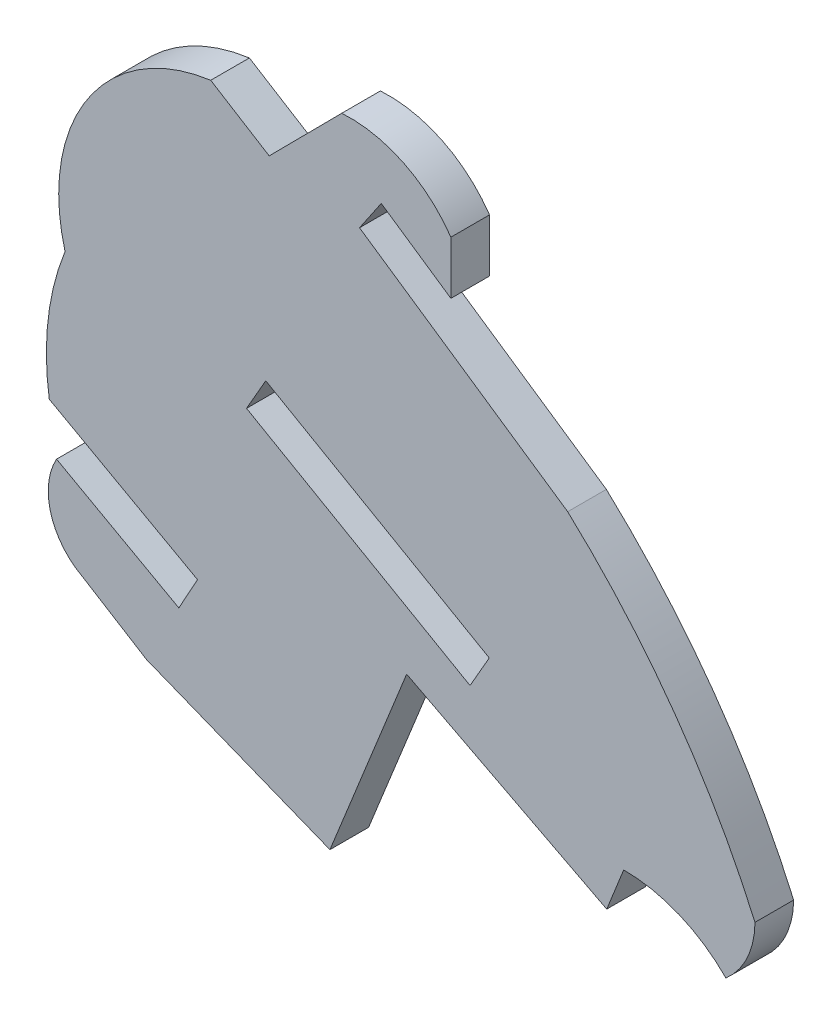
ISO-10303-21;
HEADER;
FILE_DESCRIPTION(('STEP AP214'),'2;1');
FILE_NAME('part.step','',(''),(''),'','','');
FILE_SCHEMA(('AUTOMOTIVE_DESIGN { 1 0 10303 214 1 1 1 1 }'));
ENDSEC;
DATA;
#1=APPLICATION_CONTEXT('core data for automotive mechanical design processes');
#2=APPLICATION_PROTOCOL_DEFINITION('international standard','automotive_design',2000,#1);
#3=PRODUCT_CONTEXT('',#1,'mechanical');
#4=PRODUCT('Part','Part','',(#3));
#5=PRODUCT_RELATED_PRODUCT_CATEGORY('part','',(#4));
#6=PRODUCT_DEFINITION_FORMATION('','',#4);
#7=PRODUCT_DEFINITION_CONTEXT('part definition',#1,'design');
#8=PRODUCT_DEFINITION('design','',#6,#7);
#9=PRODUCT_DEFINITION_SHAPE('','',#8);
#10=(LENGTH_UNIT() NAMED_UNIT(*) SI_UNIT(.MILLI.,.METRE.));
#11=(NAMED_UNIT(*) PLANE_ANGLE_UNIT() SI_UNIT($,.RADIAN.));
#12=(NAMED_UNIT(*) SI_UNIT($,.STERADIAN.) SOLID_ANGLE_UNIT());
#13=UNCERTAINTY_MEASURE_WITH_UNIT(LENGTH_MEASURE(1.E-05),#10,'distance_accuracy_value','');
#14=(GEOMETRIC_REPRESENTATION_CONTEXT(3) GLOBAL_UNCERTAINTY_ASSIGNED_CONTEXT((#13)) GLOBAL_UNIT_ASSIGNED_CONTEXT((#10,
#11,#12)) REPRESENTATION_CONTEXT('',''));
#15=CARTESIAN_POINT('',(0.,0.,0.));
#16=DIRECTION('',(0.,0.,1.));
#17=DIRECTION('',(1.,0.,0.));
#18=AXIS2_PLACEMENT_3D('',#15,#16,#17);
#19=CARTESIAN_POINT('',(246.621909042128,67.022770336583,3.));
#20=DIRECTION('',(0.,0.,1.));
#21=DIRECTION('',(1.,0.,0.));
#22=AXIS2_PLACEMENT_3D('',#19,#20,#21);
#23=PLANE('',#22);
#24=CARTESIAN_POINT('',(246.621909042128,67.022770336583,3.));
#25=DIRECTION('',(0.,0.,1.));
#26=DIRECTION('',(1.,0.,0.));
#27=AXIS2_PLACEMENT_3D('',#24,#25,#26);
#28=CIRCLE('',#27,9.51810989313976);
#29=CARTESIAN_POINT('',(254.458999609147,72.4241060401124,3.));
#30=VERTEX_POINT('',#29);
#31=CARTESIAN_POINT('',(245.989993100544,76.5198803275569,3.));
#32=VERTEX_POINT('',#31);
#33=EDGE_CURVE('E277',#30,#32,#28,.T.);
#34=ORIENTED_EDGE('',*,*,#33,.T.);
#35=DIRECTION('',(-0.703939755813548,-0.710259685034398,0.));
#36=VECTOR('',#35,1.);
#37=CARTESIAN_POINT('',(240.358475054036,70.8378028472817,3.));
#38=LINE('',#37,#36);
#39=CARTESIAN_POINT('',(240.358475054036,70.8378028472817,3.));
#40=VERTEX_POINT('',#39);
#41=EDGE_CURVE('E280',#32,#40,#38,.T.);
#42=ORIENTED_EDGE('',*,*,#41,.T.);
#43=DIRECTION('',(-0.849846362291142,0.527030511925555,0.));
#44=VECTOR('',#43,1.);
#45=CARTESIAN_POINT('',(235.821369896479,73.6514794833747,3.));
#46=LINE('',#45,#44);
#47=CARTESIAN_POINT('',(235.821369896479,73.6514794833747,3.));
#48=VERTEX_POINT('',#47);
#49=EDGE_CURVE('E282',#40,#48,#46,.T.);
#50=ORIENTED_EDGE('',*,*,#49,.T.);
#51=CARTESIAN_POINT('',(237.676315734645,60.1255099214364,3.));
#52=DIRECTION('',(0.,0.,1.));
#53=DIRECTION('',(1.,0.,0.));
#54=AXIS2_PLACEMENT_3D('',#51,#52,#53);
#55=CIRCLE('',#54,13.6525703313703);
#56=CARTESIAN_POINT('',(224.516481401111,56.4907558765327,3.));
#57=VERTEX_POINT('',#56);
#58=EDGE_CURVE('E284',#48,#57,#55,.T.);
#59=ORIENTED_EDGE('',*,*,#58,.T.);
#60=CARTESIAN_POINT('',(243.342928505479,48.9582403620572,3.));
#61=DIRECTION('',(0.,0.,1.));
#62=DIRECTION('',(1.,0.,0.));
#63=AXIS2_PLACEMENT_3D('',#60,#61,#62);
#64=CIRCLE('',#63,20.2774234198873);
#65=CARTESIAN_POINT('',(223.290021137819,45.9491197839773,3.));
#66=VERTEX_POINT('',#65);
#67=EDGE_CURVE('E286',#57,#66,#64,.T.);
#68=ORIENTED_EDGE('',*,*,#67,.T.);
#69=DIRECTION('',(0.874782690041744,-0.484515474678911,0.));
#70=VECTOR('',#69,1.);
#71=CARTESIAN_POINT('',(223.290021137819,45.9491197839773,3.));
#72=LINE('',#71,#70);
#73=CARTESIAN_POINT('',(234.799244803639,39.574511517135,3.));
#74=VERTEX_POINT('',#73);
#75=EDGE_CURVE('E288',#66,#74,#72,.T.);
#76=ORIENTED_EDGE('',*,*,#75,.T.);
#77=DIRECTION('',(-0.484515474678915,-0.874782690041741,0.));
#78=VECTOR('',#77,1.);
#79=CARTESIAN_POINT('',(234.799244803639,39.574511517135,3.));
#80=LINE('',#79,#78);
#81=CARTESIAN_POINT('',(233.345698379602,36.9501634470098,3.));
#82=VERTEX_POINT('',#81);
#83=EDGE_CURVE('E290',#74,#82,#80,.T.);
#84=ORIENTED_EDGE('',*,*,#83,.T.);
#85=DIRECTION('',(-0.87478269004174,0.484515474678917,0.));
#86=VECTOR('',#85,1.);
#87=CARTESIAN_POINT('',(233.345698379602,36.9501634470098,3.));
#88=LINE('',#87,#86);
#89=CARTESIAN_POINT('',(223.856638727189,42.205864427474,3.));
#90=VERTEX_POINT('',#89);
#91=EDGE_CURVE('E292',#82,#90,#88,.T.);
#92=ORIENTED_EDGE('',*,*,#91,.T.);
#93=CARTESIAN_POINT('',(228.242820443726,39.7420682025907,3.));
#94=DIRECTION('',(0.,0.,1.));
#95=DIRECTION('',(1.,0.,0.));
#96=AXIS2_PLACEMENT_3D('',#93,#94,#95);
#97=CIRCLE('',#96,5.03079336568619);
#98=CARTESIAN_POINT('',(225.897587096994,35.2913646135379,3.));
#99=VERTEX_POINT('',#98);
#100=EDGE_CURVE('E294',#90,#99,#97,.T.);
#101=ORIENTED_EDGE('',*,*,#100,.T.);
#102=DIRECTION('',(0.849789214685174,-0.527122652335066,0.));
#103=VECTOR('',#102,1.);
#104=CARTESIAN_POINT('',(225.897587096994,35.2913646135379,3.));
#105=LINE('',#104,#103);
#106=CARTESIAN_POINT('',(230.827204857649,32.2335319838812,3.));
#107=VERTEX_POINT('',#106);
#108=EDGE_CURVE('E296',#99,#107,#105,.T.);
#109=ORIENTED_EDGE('',*,*,#108,.T.);
#110=DIRECTION('',(0.929159324329483,-0.369679523386918,0.));
#111=VECTOR('',#110,1.);
#112=CARTESIAN_POINT('',(230.827204857649,32.2335319838812,3.));
#113=LINE('',#112,#111);
#114=CARTESIAN_POINT('',(245.072593426922,26.5657973781389,3.));
#115=VERTEX_POINT('',#114);
#116=EDGE_CURVE('E298',#107,#115,#113,.T.);
#117=ORIENTED_EDGE('',*,*,#116,.T.);
#118=DIRECTION('',(0.373845984347161,0.927490797791279,0.));
#119=VECTOR('',#118,1.);
#120=CARTESIAN_POINT('',(245.072593426922,26.5657973781389,3.));
#121=LINE('',#120,#119);
#122=CARTESIAN_POINT('',(251.027196120335,41.338830749858,3.));
#123=VERTEX_POINT('',#122);
#124=EDGE_CURVE('E300',#115,#123,#121,.T.);
#125=ORIENTED_EDGE('',*,*,#124,.T.);
#126=DIRECTION('',(0.888248024105194,-0.459364177612077,0.));
#127=VECTOR('',#126,1.);
#128=CARTESIAN_POINT('',(251.027196120335,41.338830749858,3.));
#129=LINE('',#128,#127);
#130=CARTESIAN_POINT('',(266.553980850609,33.3090367001984,3.));
#131=VERTEX_POINT('',#130);
#132=EDGE_CURVE('E302',#123,#131,#129,.T.);
#133=ORIENTED_EDGE('',*,*,#132,.T.);
#134=DIRECTION('',(0.371222712670222,0.928543858736765,0.));
#135=VECTOR('',#134,1.);
#136=CARTESIAN_POINT('',(266.553980850609,33.3090367001984,3.));
#137=LINE('',#136,#135);
#138=CARTESIAN_POINT('',(267.871222170433,36.6038683369777,3.));
#139=VERTEX_POINT('',#138);
#140=EDGE_CURVE('E304',#131,#139,#137,.T.);
#141=ORIENTED_EDGE('',*,*,#140,.T.);
#142=CARTESIAN_POINT('',(267.90414333007,25.5008899926459,3.));
#143=DIRECTION('',(0.,0.,-1.));
#144=DIRECTION('',(1.,0.,0.));
#145=AXIS2_PLACEMENT_3D('',#142,#143,#144);
#146=CIRCLE('',#145,11.1030271510724);
#147=CARTESIAN_POINT('',(275.801504518251,33.3053052930298,3.));
#148=VERTEX_POINT('',#147);
#149=EDGE_CURVE('E306',#139,#148,#146,.T.);
#150=ORIENTED_EDGE('',*,*,#149,.T.);
#151=CARTESIAN_POINT('',(271.606514940468,38.2091857616653,3.));
#152=DIRECTION('',(0.,0.,1.));
#153=DIRECTION('',(1.,0.,0.));
#154=AXIS2_PLACEMENT_3D('',#151,#152,#153);
#155=CIRCLE('',#154,6.45336975605613);
#156=CARTESIAN_POINT('',(278.059793662288,38.1749082635354,3.));
#157=VERTEX_POINT('',#156);
#158=EDGE_CURVE('E308',#148,#157,#155,.T.);
#159=ORIENTED_EDGE('',*,*,#158,.T.);
#160=CARTESIAN_POINT('',(221.934945479676,13.4140046680717,3.));
#161=DIRECTION('',(0.,0.,1.));
#162=DIRECTION('',(1.,0.,0.));
#163=AXIS2_PLACEMENT_3D('',#160,#161,#162);
#164=CIRCLE('',#163,61.344118955162);
#165=CARTESIAN_POINT('',(263.523901664125,58.5079028569964,3.));
#166=VERTEX_POINT('',#165);
#167=EDGE_CURVE('E310',#157,#166,#164,.T.);
#168=ORIENTED_EDGE('',*,*,#167,.T.);
#169=DIRECTION('',(-0.82648853797509,0.562953547458223,0.));
#170=VECTOR('',#169,1.);
#171=CARTESIAN_POINT('',(247.368253342713,69.512144435844,3.));
#172=LINE('',#171,#170);
#173=CARTESIAN_POINT('',(247.368253342713,69.512144435844,3.));
#174=VERTEX_POINT('',#173);
#175=EDGE_CURVE('E312',#166,#174,#172,.T.);
#176=ORIENTED_EDGE('',*,*,#175,.T.);
#177=DIRECTION('',(0.56295354745822,0.826488537975092,0.));
#178=VECTOR('',#177,1.);
#179=CARTESIAN_POINT('',(247.368253342713,69.512144435844,3.));
#180=LINE('',#179,#178);
#181=CARTESIAN_POINT('',(249.057113985087,71.9916100497692,3.));
#182=VERTEX_POINT('',#181);
#183=EDGE_CURVE('E314',#174,#182,#180,.T.);
#184=ORIENTED_EDGE('',*,*,#183,.T.);
#185=DIRECTION('',(0.82648853797509,-0.562953547458223,0.));
#186=VECTOR('',#185,1.);
#187=CARTESIAN_POINT('',(249.057113985087,71.9916100497692,3.));
#188=LINE('',#187,#186);
#189=CARTESIAN_POINT('',(254.458999609147,68.3121752659807,3.));
#190=VERTEX_POINT('',#189);
#191=EDGE_CURVE('E316',#182,#190,#188,.T.);
#192=ORIENTED_EDGE('',*,*,#191,.T.);
#193=DIRECTION('',(0.,1.,0.));
#194=VECTOR('',#193,1.);
#195=CARTESIAN_POINT('',(254.458999609147,72.4241060401124,3.));
#196=LINE('',#195,#194);
#197=EDGE_CURVE('E318',#190,#30,#196,.T.);
#198=ORIENTED_EDGE('',*,*,#197,.T.);
#199=EDGE_LOOP('',(#34,#42,#50,#59,#68,#76,#84,#92,#101,#109,#117,#125,#133,#141,#150,#159,#168,
#176,#184,#192,#198));
#200=FACE_BOUND('',#199,.T.);
#201=DIRECTION('',(0.867264288748163,-0.497848022454787,0.));
#202=VECTOR('',#201,1.);
#203=CARTESIAN_POINT('',(238.59978735133,52.9900322264646,3.));
#204=LINE('',#203,#202);
#205=CARTESIAN_POINT('',(238.59978735133,52.9900322264646,3.));
#206=VERTEX_POINT('',#205);
#207=CARTESIAN_POINT('',(255.945073126293,43.0330717773688,3.));
#208=VERTEX_POINT('',#207);
#209=EDGE_CURVE('E225',#206,#208,#204,.T.);
#210=ORIENTED_EDGE('',*,*,#209,.F.);
#211=DIRECTION('',(-0.497848022454784,-0.867264288748165,0.));
#212=VECTOR('',#211,1.);
#213=CARTESIAN_POINT('',(238.59978735133,52.9900322264646,3.));
#214=LINE('',#213,#212);
#215=CARTESIAN_POINT('',(240.093331418694,55.591825092709,3.));
#216=VERTEX_POINT('',#215);
#217=EDGE_CURVE('E214',#216,#206,#214,.T.);
#218=ORIENTED_EDGE('',*,*,#217,.F.);
#219=DIRECTION('',(-0.867264288748164,0.497848022454787,0.));
#220=VECTOR('',#219,1.);
#221=CARTESIAN_POINT('',(240.093331418694,55.591825092709,3.));
#222=LINE('',#221,#220);
#223=CARTESIAN_POINT('',(257.438617193657,45.6348646436133,3.));
#224=VERTEX_POINT('',#223);
#225=EDGE_CURVE('E229',#224,#216,#222,.T.);
#226=ORIENTED_EDGE('',*,*,#225,.F.);
#227=DIRECTION('',(0.497848022454782,0.867264288748166,0.));
#228=VECTOR('',#227,1.);
#229=CARTESIAN_POINT('',(255.945073126293,43.0330717773688,3.));
#230=LINE('',#229,#228);
#231=EDGE_CURVE('E227',#208,#224,#230,.T.);
#232=ORIENTED_EDGE('',*,*,#231,.F.);
#233=EDGE_LOOP('',(#210,#218,#226,#232));
#234=FACE_BOUND('',#233,.T.);
#235=ADVANCED_FACE('F32',(#200,#234),#23,.T.);
#236=CARTESIAN_POINT('',(246.621909042128,67.022770336583,0.));
#237=DIRECTION('',(0.,0.,1.));
#238=DIRECTION('',(1.,0.,0.));
#239=AXIS2_PLACEMENT_3D('',#236,#237,#238);
#240=PLANE('',#239);
#241=CARTESIAN_POINT('',(246.621909042128,67.022770336583,0.));
#242=DIRECTION('',(0.,0.,1.));
#243=DIRECTION('',(1.,0.,0.));
#244=AXIS2_PLACEMENT_3D('',#241,#242,#243);
#245=CIRCLE('',#244,9.51810989313976);
#246=CARTESIAN_POINT('',(254.458999609147,72.4241060401124,0.));
#247=VERTEX_POINT('',#246);
#248=CARTESIAN_POINT('',(245.989993100544,76.5198803275569,0.));
#249=VERTEX_POINT('',#248);
#250=EDGE_CURVE('E215',#247,#249,#245,.T.);
#251=ORIENTED_EDGE('',*,*,#250,.F.);
#252=DIRECTION('',(0.,1.,0.));
#253=VECTOR('',#252,1.);
#254=CARTESIAN_POINT('',(254.458999609147,72.4241060401124,0.));
#255=LINE('',#254,#253);
#256=CARTESIAN_POINT('',(254.458999609147,68.3121752659807,0.));
#257=VERTEX_POINT('',#256);
#258=EDGE_CURVE('E275',#257,#247,#255,.T.);
#259=ORIENTED_EDGE('',*,*,#258,.F.);
#260=DIRECTION('',(0.82648853797509,-0.562953547458223,0.));
#261=VECTOR('',#260,1.);
#262=CARTESIAN_POINT('',(249.057113985087,71.9916100497692,0.));
#263=LINE('',#262,#261);
#264=CARTESIAN_POINT('',(249.057113985087,71.9916100497692,0.));
#265=VERTEX_POINT('',#264);
#266=EDGE_CURVE('E273',#265,#257,#263,.T.);
#267=ORIENTED_EDGE('',*,*,#266,.F.);
#268=DIRECTION('',(0.56295354745822,0.826488537975092,0.));
#269=VECTOR('',#268,1.);
#270=CARTESIAN_POINT('',(247.368253342713,69.512144435844,0.));
#271=LINE('',#270,#269);
#272=CARTESIAN_POINT('',(247.368253342713,69.512144435844,0.));
#273=VERTEX_POINT('',#272);
#274=EDGE_CURVE('E271',#273,#265,#271,.T.);
#275=ORIENTED_EDGE('',*,*,#274,.F.);
#276=DIRECTION('',(-0.82648853797509,0.562953547458223,0.));
#277=VECTOR('',#276,1.);
#278=CARTESIAN_POINT('',(247.368253342713,69.512144435844,0.));
#279=LINE('',#278,#277);
#280=CARTESIAN_POINT('',(263.523901664125,58.5079028569964,0.));
#281=VERTEX_POINT('',#280);
#282=EDGE_CURVE('E269',#281,#273,#279,.T.);
#283=ORIENTED_EDGE('',*,*,#282,.F.);
#284=CARTESIAN_POINT('',(221.934945479676,13.4140046680717,0.));
#285=DIRECTION('',(0.,0.,1.));
#286=DIRECTION('',(1.,0.,0.));
#287=AXIS2_PLACEMENT_3D('',#284,#285,#286);
#288=CIRCLE('',#287,61.344118955162);
#289=CARTESIAN_POINT('',(278.059793662288,38.1749082635354,0.));
#290=VERTEX_POINT('',#289);
#291=EDGE_CURVE('E267',#290,#281,#288,.T.);
#292=ORIENTED_EDGE('',*,*,#291,.F.);
#293=CARTESIAN_POINT('',(271.606514940468,38.2091857616653,0.));
#294=DIRECTION('',(0.,0.,1.));
#295=DIRECTION('',(1.,0.,0.));
#296=AXIS2_PLACEMENT_3D('',#293,#294,#295);
#297=CIRCLE('',#296,6.45336975605613);
#298=CARTESIAN_POINT('',(275.801504518251,33.3053052930298,0.));
#299=VERTEX_POINT('',#298);
#300=EDGE_CURVE('E265',#299,#290,#297,.T.);
#301=ORIENTED_EDGE('',*,*,#300,.F.);
#302=CARTESIAN_POINT('',(267.90414333007,25.5008899926459,0.));
#303=DIRECTION('',(0.,0.,-1.));
#304=DIRECTION('',(1.,0.,0.));
#305=AXIS2_PLACEMENT_3D('',#302,#303,#304);
#306=CIRCLE('',#305,11.1030271510724);
#307=CARTESIAN_POINT('',(267.871222170433,36.6038683369777,0.));
#308=VERTEX_POINT('',#307);
#309=EDGE_CURVE('E263',#308,#299,#306,.T.);
#310=ORIENTED_EDGE('',*,*,#309,.F.);
#311=DIRECTION('',(0.371222712670222,0.928543858736765,0.));
#312=VECTOR('',#311,1.);
#313=CARTESIAN_POINT('',(266.553980850609,33.3090367001984,0.));
#314=LINE('',#313,#312);
#315=CARTESIAN_POINT('',(266.553980850609,33.3090367001984,0.));
#316=VERTEX_POINT('',#315);
#317=EDGE_CURVE('E261',#316,#308,#314,.T.);
#318=ORIENTED_EDGE('',*,*,#317,.F.);
#319=DIRECTION('',(0.888248024105194,-0.459364177612077,0.));
#320=VECTOR('',#319,1.);
#321=CARTESIAN_POINT('',(251.027196120335,41.338830749858,0.));
#322=LINE('',#321,#320);
#323=CARTESIAN_POINT('',(251.027196120335,41.338830749858,0.));
#324=VERTEX_POINT('',#323);
#325=EDGE_CURVE('E259',#324,#316,#322,.T.);
#326=ORIENTED_EDGE('',*,*,#325,.F.);
#327=DIRECTION('',(0.373845984347161,0.927490797791279,0.));
#328=VECTOR('',#327,1.);
#329=CARTESIAN_POINT('',(245.072593426922,26.5657973781389,0.));
#330=LINE('',#329,#328);
#331=CARTESIAN_POINT('',(245.072593426922,26.5657973781389,0.));
#332=VERTEX_POINT('',#331);
#333=EDGE_CURVE('E257',#332,#324,#330,.T.);
#334=ORIENTED_EDGE('',*,*,#333,.F.);
#335=DIRECTION('',(0.929159324329483,-0.369679523386918,0.));
#336=VECTOR('',#335,1.);
#337=CARTESIAN_POINT('',(230.827204857649,32.2335319838812,0.));
#338=LINE('',#337,#336);
#339=CARTESIAN_POINT('',(230.827204857649,32.2335319838812,0.));
#340=VERTEX_POINT('',#339);
#341=EDGE_CURVE('E255',#340,#332,#338,.T.);
#342=ORIENTED_EDGE('',*,*,#341,.F.);
#343=DIRECTION('',(0.849789214685174,-0.527122652335066,0.));
#344=VECTOR('',#343,1.);
#345=CARTESIAN_POINT('',(225.897587096994,35.2913646135379,0.));
#346=LINE('',#345,#344);
#347=CARTESIAN_POINT('',(225.897587096994,35.2913646135379,0.));
#348=VERTEX_POINT('',#347);
#349=EDGE_CURVE('E253',#348,#340,#346,.T.);
#350=ORIENTED_EDGE('',*,*,#349,.F.);
#351=CARTESIAN_POINT('',(228.242820443726,39.7420682025907,0.));
#352=DIRECTION('',(0.,0.,1.));
#353=DIRECTION('',(1.,0.,0.));
#354=AXIS2_PLACEMENT_3D('',#351,#352,#353);
#355=CIRCLE('',#354,5.03079336568619);
#356=CARTESIAN_POINT('',(223.856638727189,42.205864427474,0.));
#357=VERTEX_POINT('',#356);
#358=EDGE_CURVE('E251',#357,#348,#355,.T.);
#359=ORIENTED_EDGE('',*,*,#358,.F.);
#360=DIRECTION('',(-0.87478269004174,0.484515474678917,0.));
#361=VECTOR('',#360,1.);
#362=CARTESIAN_POINT('',(233.345698379602,36.9501634470098,0.));
#363=LINE('',#362,#361);
#364=CARTESIAN_POINT('',(233.345698379602,36.9501634470098,0.));
#365=VERTEX_POINT('',#364);
#366=EDGE_CURVE('E249',#365,#357,#363,.T.);
#367=ORIENTED_EDGE('',*,*,#366,.F.);
#368=DIRECTION('',(-0.484515474678915,-0.874782690041741,0.));
#369=VECTOR('',#368,1.);
#370=CARTESIAN_POINT('',(234.799244803639,39.574511517135,0.));
#371=LINE('',#370,#369);
#372=CARTESIAN_POINT('',(234.799244803639,39.574511517135,0.));
#373=VERTEX_POINT('',#372);
#374=EDGE_CURVE('E247',#373,#365,#371,.T.);
#375=ORIENTED_EDGE('',*,*,#374,.F.);
#376=DIRECTION('',(0.874782690041744,-0.484515474678911,0.));
#377=VECTOR('',#376,1.);
#378=CARTESIAN_POINT('',(223.290021137819,45.9491197839773,0.));
#379=LINE('',#378,#377);
#380=CARTESIAN_POINT('',(223.290021137819,45.9491197839773,0.));
#381=VERTEX_POINT('',#380);
#382=EDGE_CURVE('E245',#381,#373,#379,.T.);
#383=ORIENTED_EDGE('',*,*,#382,.F.);
#384=CARTESIAN_POINT('',(243.342928505479,48.9582403620572,0.));
#385=DIRECTION('',(0.,0.,1.));
#386=DIRECTION('',(1.,0.,0.));
#387=AXIS2_PLACEMENT_3D('',#384,#385,#386);
#388=CIRCLE('',#387,20.2774234198873);
#389=CARTESIAN_POINT('',(224.516481401111,56.4907558765327,0.));
#390=VERTEX_POINT('',#389);
#391=EDGE_CURVE('E243',#390,#381,#388,.T.);
#392=ORIENTED_EDGE('',*,*,#391,.F.);
#393=CARTESIAN_POINT('',(237.676315734645,60.1255099214364,0.));
#394=DIRECTION('',(0.,0.,1.));
#395=DIRECTION('',(1.,0.,0.));
#396=AXIS2_PLACEMENT_3D('',#393,#394,#395);
#397=CIRCLE('',#396,13.6525703313703);
#398=CARTESIAN_POINT('',(235.821369896479,73.6514794833747,0.));
#399=VERTEX_POINT('',#398);
#400=EDGE_CURVE('E241',#399,#390,#397,.T.);
#401=ORIENTED_EDGE('',*,*,#400,.F.);
#402=DIRECTION('',(-0.849846362291142,0.527030511925555,0.));
#403=VECTOR('',#402,1.);
#404=CARTESIAN_POINT('',(235.821369896479,73.6514794833747,0.));
#405=LINE('',#404,#403);
#406=CARTESIAN_POINT('',(240.358475054036,70.8378028472817,0.));
#407=VERTEX_POINT('',#406);
#408=EDGE_CURVE('E239',#407,#399,#405,.T.);
#409=ORIENTED_EDGE('',*,*,#408,.F.);
#410=DIRECTION('',(-0.703939755813548,-0.710259685034398,0.));
#411=VECTOR('',#410,1.);
#412=CARTESIAN_POINT('',(240.358475054036,70.8378028472817,0.));
#413=LINE('',#412,#411);
#414=EDGE_CURVE('E237',#249,#407,#413,.T.);
#415=ORIENTED_EDGE('',*,*,#414,.F.);
#416=EDGE_LOOP('',(#251,#259,#267,#275,#283,#292,#301,#310,#318,#326,#334,#342,#350,#359,#367,
#375,#383,#392,#401,#409,#415));
#417=FACE_BOUND('',#416,.T.);
#418=DIRECTION('',(-0.497848022454784,-0.867264288748165,0.));
#419=VECTOR('',#418,1.);
#420=CARTESIAN_POINT('',(238.59978735133,52.9900322264646,0.));
#421=LINE('',#420,#419);
#422=CARTESIAN_POINT('',(240.093331418694,55.591825092709,0.));
#423=VERTEX_POINT('',#422);
#424=CARTESIAN_POINT('',(238.59978735133,52.9900322264646,0.));
#425=VERTEX_POINT('',#424);
#426=EDGE_CURVE('E55',#423,#425,#421,.T.);
#427=ORIENTED_EDGE('',*,*,#426,.T.);
#428=DIRECTION('',(0.867264288748163,-0.497848022454787,0.));
#429=VECTOR('',#428,1.);
#430=CARTESIAN_POINT('',(238.59978735133,52.9900322264646,0.));
#431=LINE('',#430,#429);
#432=CARTESIAN_POINT('',(255.945073126293,43.0330717773688,0.));
#433=VERTEX_POINT('',#432);
#434=EDGE_CURVE('E201',#425,#433,#431,.T.);
#435=ORIENTED_EDGE('',*,*,#434,.T.);
#436=DIRECTION('',(0.497848022454782,0.867264288748166,0.));
#437=VECTOR('',#436,1.);
#438=CARTESIAN_POINT('',(255.945073126293,43.0330717773688,0.));
#439=LINE('',#438,#437);
#440=CARTESIAN_POINT('',(257.438617193658,45.6348646436133,0.));
#441=VERTEX_POINT('',#440);
#442=EDGE_CURVE('E210',#433,#441,#439,.T.);
#443=ORIENTED_EDGE('',*,*,#442,.T.);
#444=DIRECTION('',(-0.867264288748164,0.497848022454787,0.));
#445=VECTOR('',#444,1.);
#446=CARTESIAN_POINT('',(240.093331418694,55.591825092709,0.));
#447=LINE('',#446,#445);
#448=EDGE_CURVE('E219',#441,#423,#447,.T.);
#449=ORIENTED_EDGE('',*,*,#448,.T.);
#450=EDGE_LOOP('',(#427,#435,#443,#449));
#451=FACE_BOUND('',#450,.T.);
#452=ADVANCED_FACE('F218',(#417,#451),#240,.F.);
#453=CARTESIAN_POINT('',(246.621909042128,67.022770336583,3.));
#454=DIRECTION('',(0.,0.,-1.));
#455=DIRECTION('',(-1.,0.,0.));
#456=AXIS2_PLACEMENT_3D('',#453,#454,#455);
#457=CYLINDRICAL_SURFACE('',#456,9.51810989313976);
#458=ORIENTED_EDGE('',*,*,#250,.T.);
#459=DIRECTION('',(0.,0.,-1.));
#460=VECTOR('',#459,1.);
#461=CARTESIAN_POINT('',(245.989993100544,76.5198803275569,3.));
#462=LINE('',#461,#460);
#463=EDGE_CURVE('E11',#32,#249,#462,.T.);
#464=ORIENTED_EDGE('',*,*,#463,.F.);
#465=ORIENTED_EDGE('',*,*,#33,.F.);
#466=DIRECTION('',(0.,0.,-1.));
#467=VECTOR('',#466,1.);
#468=CARTESIAN_POINT('',(254.458999609147,72.4241060401124,3.));
#469=LINE('',#468,#467);
#470=EDGE_CURVE('E320',#30,#247,#469,.T.);
#471=ORIENTED_EDGE('',*,*,#470,.T.);
#472=EDGE_LOOP('',(#458,#464,#465,#471));
#473=FACE_BOUND('',#472,.T.);
#474=ADVANCED_FACE('F34',(#473),#457,.T.);
#475=CARTESIAN_POINT('',(240.358475054036,70.8378028472817,3.));
#476=DIRECTION('',(0.710259685034399,-0.703939755813548,0.));
#477=DIRECTION('',(0.703939755813548,0.710259685034399,0.));
#478=AXIS2_PLACEMENT_3D('',#475,#476,#477);
#479=PLANE('',#478);
#480=ORIENTED_EDGE('',*,*,#414,.T.);
#481=DIRECTION('',(0.,0.,-1.));
#482=VECTOR('',#481,1.);
#483=CARTESIAN_POINT('',(240.358475054036,70.8378028472817,3.));
#484=LINE('',#483,#482);
#485=EDGE_CURVE('E40',#40,#407,#484,.T.);
#486=ORIENTED_EDGE('',*,*,#485,.F.);
#487=ORIENTED_EDGE('',*,*,#41,.F.);
#488=ORIENTED_EDGE('',*,*,#463,.T.);
#489=EDGE_LOOP('',(#480,#486,#487,#488));
#490=FACE_BOUND('',#489,.T.);
#491=ADVANCED_FACE('F403',(#490),#479,.F.);
#492=CARTESIAN_POINT('',(235.821369896479,73.6514794833747,3.));
#493=DIRECTION('',(-0.527030511925555,-0.849846362291142,0.));
#494=DIRECTION('',(0.849846362291142,-0.527030511925555,0.));
#495=AXIS2_PLACEMENT_3D('',#492,#493,#494);
#496=PLANE('',#495);
#497=ORIENTED_EDGE('',*,*,#408,.T.);
#498=DIRECTION('',(0.,0.,-1.));
#499=VECTOR('',#498,1.);
#500=CARTESIAN_POINT('',(235.821369896479,73.6514794833747,3.));
#501=LINE('',#500,#499);
#502=EDGE_CURVE('E374',#48,#399,#501,.T.);
#503=ORIENTED_EDGE('',*,*,#502,.F.);
#504=ORIENTED_EDGE('',*,*,#49,.F.);
#505=ORIENTED_EDGE('',*,*,#485,.T.);
#506=EDGE_LOOP('',(#497,#503,#504,#505));
#507=FACE_BOUND('',#506,.T.);
#508=ADVANCED_FACE('F381',(#507),#496,.F.);
#509=CARTESIAN_POINT('',(237.676315734645,60.1255099214364,3.));
#510=DIRECTION('',(0.,0.,-1.));
#511=DIRECTION('',(-1.,0.,0.));
#512=AXIS2_PLACEMENT_3D('',#509,#510,#511);
#513=CYLINDRICAL_SURFACE('',#512,13.6525703313703);
#514=ORIENTED_EDGE('',*,*,#400,.T.);
#515=DIRECTION('',(0.,0.,-1.));
#516=VECTOR('',#515,1.);
#517=CARTESIAN_POINT('',(224.516481401111,56.4907558765327,3.));
#518=LINE('',#517,#516);
#519=EDGE_CURVE('E371',#57,#390,#518,.T.);
#520=ORIENTED_EDGE('',*,*,#519,.F.);
#521=ORIENTED_EDGE('',*,*,#58,.F.);
#522=ORIENTED_EDGE('',*,*,#502,.T.);
#523=EDGE_LOOP('',(#514,#520,#521,#522));
#524=FACE_BOUND('',#523,.T.);
#525=ADVANCED_FACE('F391',(#524),#513,.T.);
#526=CARTESIAN_POINT('',(243.342928505479,48.9582403620572,3.));
#527=DIRECTION('',(0.,0.,-1.));
#528=DIRECTION('',(-1.,0.,0.));
#529=AXIS2_PLACEMENT_3D('',#526,#527,#528);
#530=CYLINDRICAL_SURFACE('',#529,20.2774234198873);
#531=ORIENTED_EDGE('',*,*,#391,.T.);
#532=DIRECTION('',(0.,0.,-1.));
#533=VECTOR('',#532,1.);
#534=CARTESIAN_POINT('',(223.290021137819,45.9491197839773,3.));
#535=LINE('',#534,#533);
#536=EDGE_CURVE('E368',#66,#381,#535,.T.);
#537=ORIENTED_EDGE('',*,*,#536,.F.);
#538=ORIENTED_EDGE('',*,*,#67,.F.);
#539=ORIENTED_EDGE('',*,*,#519,.T.);
#540=EDGE_LOOP('',(#531,#537,#538,#539));
#541=FACE_BOUND('',#540,.T.);
#542=ADVANCED_FACE('F395',(#541),#530,.T.);
#543=CARTESIAN_POINT('',(223.290021137819,45.9491197839773,3.));
#544=DIRECTION('',(0.484515474678911,0.874782690041744,0.));
#545=DIRECTION('',(-0.874782690041744,0.484515474678911,0.));
#546=AXIS2_PLACEMENT_3D('',#543,#544,#545);
#547=PLANE('',#546);
#548=ORIENTED_EDGE('',*,*,#382,.T.);
#549=DIRECTION('',(0.,0.,-1.));
#550=VECTOR('',#549,1.);
#551=CARTESIAN_POINT('',(234.799244803639,39.574511517135,3.));
#552=LINE('',#551,#550);
#553=EDGE_CURVE('E365',#74,#373,#552,.T.);
#554=ORIENTED_EDGE('',*,*,#553,.F.);
#555=ORIENTED_EDGE('',*,*,#75,.F.);
#556=ORIENTED_EDGE('',*,*,#536,.T.);
#557=EDGE_LOOP('',(#548,#554,#555,#556));
#558=FACE_BOUND('',#557,.T.);
#559=ADVANCED_FACE('F481',(#558),#547,.F.);
#560=CARTESIAN_POINT('',(234.799244803639,39.574511517135,3.));
#561=DIRECTION('',(0.874782690041741,-0.484515474678916,0.));
#562=DIRECTION('',(0.484515474678916,0.874782690041741,0.));
#563=AXIS2_PLACEMENT_3D('',#560,#561,#562);
#564=PLANE('',#563);
#565=ORIENTED_EDGE('',*,*,#374,.T.);
#566=DIRECTION('',(0.,0.,-1.));
#567=VECTOR('',#566,1.);
#568=CARTESIAN_POINT('',(233.345698379602,36.9501634470098,3.));
#569=LINE('',#568,#567);
#570=EDGE_CURVE('E362',#82,#365,#569,.T.);
#571=ORIENTED_EDGE('',*,*,#570,.F.);
#572=ORIENTED_EDGE('',*,*,#83,.F.);
#573=ORIENTED_EDGE('',*,*,#553,.T.);
#574=EDGE_LOOP('',(#565,#571,#572,#573));
#575=FACE_BOUND('',#574,.T.);
#576=ADVANCED_FACE('F479',(#575),#564,.F.);
#577=CARTESIAN_POINT('',(233.345698379602,36.9501634470098,3.));
#578=DIRECTION('',(-0.484515474678917,-0.874782690041741,0.));
#579=DIRECTION('',(0.874782690041741,-0.484515474678917,0.));
#580=AXIS2_PLACEMENT_3D('',#577,#578,#579);
#581=PLANE('',#580);
#582=ORIENTED_EDGE('',*,*,#366,.T.);
#583=DIRECTION('',(0.,0.,-1.));
#584=VECTOR('',#583,1.);
#585=CARTESIAN_POINT('',(223.856638727189,42.205864427474,3.));
#586=LINE('',#585,#584);
#587=EDGE_CURVE('E359',#90,#357,#586,.T.);
#588=ORIENTED_EDGE('',*,*,#587,.F.);
#589=ORIENTED_EDGE('',*,*,#91,.F.);
#590=ORIENTED_EDGE('',*,*,#570,.T.);
#591=EDGE_LOOP('',(#582,#588,#589,#590));
#592=FACE_BOUND('',#591,.T.);
#593=ADVANCED_FACE('F475',(#592),#581,.F.);
#594=CARTESIAN_POINT('',(228.242820443726,39.7420682025907,3.));
#595=DIRECTION('',(0.,0.,-1.));
#596=DIRECTION('',(-1.,0.,0.));
#597=AXIS2_PLACEMENT_3D('',#594,#595,#596);
#598=CYLINDRICAL_SURFACE('',#597,5.03079336568619);
#599=ORIENTED_EDGE('',*,*,#358,.T.);
#600=DIRECTION('',(0.,0.,-1.));
#601=VECTOR('',#600,1.);
#602=CARTESIAN_POINT('',(225.897587096994,35.2913646135379,3.));
#603=LINE('',#602,#601);
#604=EDGE_CURVE('E356',#99,#348,#603,.T.);
#605=ORIENTED_EDGE('',*,*,#604,.F.);
#606=ORIENTED_EDGE('',*,*,#100,.F.);
#607=ORIENTED_EDGE('',*,*,#587,.T.);
#608=EDGE_LOOP('',(#599,#605,#606,#607));
#609=FACE_BOUND('',#608,.T.);
#610=ADVANCED_FACE('F470',(#609),#598,.T.);
#611=CARTESIAN_POINT('',(225.897587096994,35.2913646135379,3.));
#612=DIRECTION('',(0.527122652335066,0.849789214685174,0.));
#613=DIRECTION('',(-0.849789214685174,0.527122652335066,0.));
#614=AXIS2_PLACEMENT_3D('',#611,#612,#613);
#615=PLANE('',#614);
#616=ORIENTED_EDGE('',*,*,#349,.T.);
#617=DIRECTION('',(0.,0.,-1.));
#618=VECTOR('',#617,1.);
#619=CARTESIAN_POINT('',(230.827204857649,32.2335319838812,3.));
#620=LINE('',#619,#618);
#621=EDGE_CURVE('E353',#107,#340,#620,.T.);
#622=ORIENTED_EDGE('',*,*,#621,.F.);
#623=ORIENTED_EDGE('',*,*,#108,.F.);
#624=ORIENTED_EDGE('',*,*,#604,.T.);
#625=EDGE_LOOP('',(#616,#622,#623,#624));
#626=FACE_BOUND('',#625,.T.);
#627=ADVANCED_FACE('F464',(#626),#615,.F.);
#628=CARTESIAN_POINT('',(230.827204857649,32.2335319838812,3.));
#629=DIRECTION('',(0.369679523386918,0.929159324329483,0.));
#630=DIRECTION('',(-0.929159324329483,0.369679523386918,0.));
#631=AXIS2_PLACEMENT_3D('',#628,#629,#630);
#632=PLANE('',#631);
#633=ORIENTED_EDGE('',*,*,#341,.T.);
#634=DIRECTION('',(0.,0.,-1.));
#635=VECTOR('',#634,1.);
#636=CARTESIAN_POINT('',(245.072593426922,26.5657973781389,3.));
#637=LINE('',#636,#635);
#638=EDGE_CURVE('E350',#115,#332,#637,.T.);
#639=ORIENTED_EDGE('',*,*,#638,.F.);
#640=ORIENTED_EDGE('',*,*,#116,.F.);
#641=ORIENTED_EDGE('',*,*,#621,.T.);
#642=EDGE_LOOP('',(#633,#639,#640,#641));
#643=FACE_BOUND('',#642,.T.);
#644=ADVANCED_FACE('F460',(#643),#632,.F.);
#645=CARTESIAN_POINT('',(245.072593426922,26.5657973781389,3.));
#646=DIRECTION('',(-0.927490797791279,0.373845984347161,0.));
#647=DIRECTION('',(-0.373845984347161,-0.927490797791279,0.));
#648=AXIS2_PLACEMENT_3D('',#645,#646,#647);
#649=PLANE('',#648);
#650=ORIENTED_EDGE('',*,*,#333,.T.);
#651=DIRECTION('',(0.,0.,-1.));
#652=VECTOR('',#651,1.);
#653=CARTESIAN_POINT('',(251.027196120335,41.338830749858,3.));
#654=LINE('',#653,#652);
#655=EDGE_CURVE('E347',#123,#324,#654,.T.);
#656=ORIENTED_EDGE('',*,*,#655,.F.);
#657=ORIENTED_EDGE('',*,*,#124,.F.);
#658=ORIENTED_EDGE('',*,*,#638,.T.);
#659=EDGE_LOOP('',(#650,#656,#657,#658));
#660=FACE_BOUND('',#659,.T.);
#661=ADVANCED_FACE('F455',(#660),#649,.F.);
#662=CARTESIAN_POINT('',(251.027196120335,41.338830749858,3.));
#663=DIRECTION('',(0.459364177612077,0.888248024105194,0.));
#664=DIRECTION('',(-0.888248024105194,0.459364177612077,0.));
#665=AXIS2_PLACEMENT_3D('',#662,#663,#664);
#666=PLANE('',#665);
#667=ORIENTED_EDGE('',*,*,#325,.T.);
#668=DIRECTION('',(0.,0.,-1.));
#669=VECTOR('',#668,1.);
#670=CARTESIAN_POINT('',(266.553980850609,33.3090367001984,3.));
#671=LINE('',#670,#669);
#672=EDGE_CURVE('E344',#131,#316,#671,.T.);
#673=ORIENTED_EDGE('',*,*,#672,.F.);
#674=ORIENTED_EDGE('',*,*,#132,.F.);
#675=ORIENTED_EDGE('',*,*,#655,.T.);
#676=EDGE_LOOP('',(#667,#673,#674,#675));
#677=FACE_BOUND('',#676,.T.);
#678=ADVANCED_FACE('F449',(#677),#666,.F.);
#679=CARTESIAN_POINT('',(266.553980850609,33.3090367001984,3.));
#680=DIRECTION('',(-0.928543858736765,0.371222712670222,0.));
#681=DIRECTION('',(-0.371222712670222,-0.928543858736765,0.));
#682=AXIS2_PLACEMENT_3D('',#679,#680,#681);
#683=PLANE('',#682);
#684=ORIENTED_EDGE('',*,*,#317,.T.);
#685=DIRECTION('',(0.,0.,-1.));
#686=VECTOR('',#685,1.);
#687=CARTESIAN_POINT('',(267.871222170433,36.6038683369777,3.));
#688=LINE('',#687,#686);
#689=EDGE_CURVE('E341',#139,#308,#688,.T.);
#690=ORIENTED_EDGE('',*,*,#689,.F.);
#691=ORIENTED_EDGE('',*,*,#140,.F.);
#692=ORIENTED_EDGE('',*,*,#672,.T.);
#693=EDGE_LOOP('',(#684,#690,#691,#692));
#694=FACE_BOUND('',#693,.T.);
#695=ADVANCED_FACE('F445',(#694),#683,.F.);
#696=CARTESIAN_POINT('',(267.90414333007,25.5008899926459,3.));
#697=DIRECTION('',(0.,0.,-1.));
#698=DIRECTION('',(-1.,0.,0.));
#699=AXIS2_PLACEMENT_3D('',#696,#697,#698);
#700=CYLINDRICAL_SURFACE('',#699,11.1030271510724);
#701=ORIENTED_EDGE('',*,*,#309,.T.);
#702=DIRECTION('',(0.,0.,-1.));
#703=VECTOR('',#702,1.);
#704=CARTESIAN_POINT('',(275.801504518251,33.3053052930298,3.));
#705=LINE('',#704,#703);
#706=EDGE_CURVE('E338',#148,#299,#705,.T.);
#707=ORIENTED_EDGE('',*,*,#706,.F.);
#708=ORIENTED_EDGE('',*,*,#149,.F.);
#709=ORIENTED_EDGE('',*,*,#689,.T.);
#710=EDGE_LOOP('',(#701,#707,#708,#709));
#711=FACE_BOUND('',#710,.T.);
#712=ADVANCED_FACE('F440',(#711),#700,.F.);
#713=CARTESIAN_POINT('',(271.606514940468,38.2091857616653,3.));
#714=DIRECTION('',(0.,0.,-1.));
#715=DIRECTION('',(-1.,0.,0.));
#716=AXIS2_PLACEMENT_3D('',#713,#714,#715);
#717=CYLINDRICAL_SURFACE('',#716,6.45336975605613);
#718=ORIENTED_EDGE('',*,*,#300,.T.);
#719=DIRECTION('',(0.,0.,-1.));
#720=VECTOR('',#719,1.);
#721=CARTESIAN_POINT('',(278.059793662288,38.1749082635354,3.));
#722=LINE('',#721,#720);
#723=EDGE_CURVE('E335',#157,#290,#722,.T.);
#724=ORIENTED_EDGE('',*,*,#723,.F.);
#725=ORIENTED_EDGE('',*,*,#158,.F.);
#726=ORIENTED_EDGE('',*,*,#706,.T.);
#727=EDGE_LOOP('',(#718,#724,#725,#726));
#728=FACE_BOUND('',#727,.T.);
#729=ADVANCED_FACE('F434',(#728),#717,.T.);
#730=CARTESIAN_POINT('',(221.934945479676,13.4140046680717,3.));
#731=DIRECTION('',(0.,0.,-1.));
#732=DIRECTION('',(-1.,0.,0.));
#733=AXIS2_PLACEMENT_3D('',#730,#731,#732);
#734=CYLINDRICAL_SURFACE('',#733,61.344118955162);
#735=ORIENTED_EDGE('',*,*,#291,.T.);
#736=DIRECTION('',(0.,0.,-1.));
#737=VECTOR('',#736,1.);
#738=CARTESIAN_POINT('',(263.523901664125,58.5079028569964,3.));
#739=LINE('',#738,#737);
#740=EDGE_CURVE('E332',#166,#281,#739,.T.);
#741=ORIENTED_EDGE('',*,*,#740,.F.);
#742=ORIENTED_EDGE('',*,*,#167,.F.);
#743=ORIENTED_EDGE('',*,*,#723,.T.);
#744=EDGE_LOOP('',(#735,#741,#742,#743));
#745=FACE_BOUND('',#744,.T.);
#746=ADVANCED_FACE('F430',(#745),#734,.T.);
#747=CARTESIAN_POINT('',(247.368253342713,69.512144435844,3.));
#748=DIRECTION('',(-0.562953547458223,-0.82648853797509,0.));
#749=DIRECTION('',(0.82648853797509,-0.562953547458223,0.));
#750=AXIS2_PLACEMENT_3D('',#747,#748,#749);
#751=PLANE('',#750);
#752=ORIENTED_EDGE('',*,*,#282,.T.);
#753=DIRECTION('',(0.,0.,-1.));
#754=VECTOR('',#753,1.);
#755=CARTESIAN_POINT('',(247.368253342713,69.512144435844,3.));
#756=LINE('',#755,#754);
#757=EDGE_CURVE('E329',#174,#273,#756,.T.);
#758=ORIENTED_EDGE('',*,*,#757,.F.);
#759=ORIENTED_EDGE('',*,*,#175,.F.);
#760=ORIENTED_EDGE('',*,*,#740,.T.);
#761=EDGE_LOOP('',(#752,#758,#759,#760));
#762=FACE_BOUND('',#761,.T.);
#763=ADVANCED_FACE('F425',(#762),#751,.F.);
#764=CARTESIAN_POINT('',(247.368253342713,69.512144435844,3.));
#765=DIRECTION('',(-0.826488537975092,0.56295354745822,0.));
#766=DIRECTION('',(-0.56295354745822,-0.826488537975092,0.));
#767=AXIS2_PLACEMENT_3D('',#764,#765,#766);
#768=PLANE('',#767);
#769=ORIENTED_EDGE('',*,*,#274,.T.);
#770=DIRECTION('',(0.,0.,-1.));
#771=VECTOR('',#770,1.);
#772=CARTESIAN_POINT('',(249.057113985087,71.9916100497692,3.));
#773=LINE('',#772,#771);
#774=EDGE_CURVE('E326',#182,#265,#773,.T.);
#775=ORIENTED_EDGE('',*,*,#774,.F.);
#776=ORIENTED_EDGE('',*,*,#183,.F.);
#777=ORIENTED_EDGE('',*,*,#757,.T.);
#778=EDGE_LOOP('',(#769,#775,#776,#777));
#779=FACE_BOUND('',#778,.T.);
#780=ADVANCED_FACE('F419',(#779),#768,.F.);
#781=CARTESIAN_POINT('',(249.057113985087,71.9916100497692,3.));
#782=DIRECTION('',(0.562953547458223,0.82648853797509,0.));
#783=DIRECTION('',(-0.82648853797509,0.562953547458223,0.));
#784=AXIS2_PLACEMENT_3D('',#781,#782,#783);
#785=PLANE('',#784);
#786=ORIENTED_EDGE('',*,*,#266,.T.);
#787=DIRECTION('',(0.,0.,-1.));
#788=VECTOR('',#787,1.);
#789=CARTESIAN_POINT('',(254.458999609147,68.3121752659807,3.));
#790=LINE('',#789,#788);
#791=EDGE_CURVE('E323',#190,#257,#790,.T.);
#792=ORIENTED_EDGE('',*,*,#791,.F.);
#793=ORIENTED_EDGE('',*,*,#191,.F.);
#794=ORIENTED_EDGE('',*,*,#774,.T.);
#795=EDGE_LOOP('',(#786,#792,#793,#794));
#796=FACE_BOUND('',#795,.T.);
#797=ADVANCED_FACE('F415',(#796),#785,.F.);
#798=CARTESIAN_POINT('',(254.458999609147,72.4241060401124,3.));
#799=DIRECTION('',(-1.,0.,0.));
#800=DIRECTION('',(0.,0.,1.));
#801=AXIS2_PLACEMENT_3D('',#798,#799,#800);
#802=PLANE('',#801);
#803=ORIENTED_EDGE('',*,*,#258,.T.);
#804=ORIENTED_EDGE('',*,*,#470,.F.);
#805=ORIENTED_EDGE('',*,*,#197,.F.);
#806=ORIENTED_EDGE('',*,*,#791,.T.);
#807=EDGE_LOOP('',(#803,#804,#805,#806));
#808=FACE_BOUND('',#807,.T.);
#809=ADVANCED_FACE('F410',(#808),#802,.F.);
#810=CARTESIAN_POINT('',(238.59978735133,52.9900322264646,3.));
#811=DIRECTION('',(0.867264288748165,-0.497848022454784,0.));
#812=DIRECTION('',(0.497848022454784,0.867264288748165,0.));
#813=AXIS2_PLACEMENT_3D('',#810,#811,#812);
#814=PLANE('',#813);
#815=ORIENTED_EDGE('',*,*,#426,.F.);
#816=DIRECTION('',(0.,0.,-1.));
#817=VECTOR('',#816,1.);
#818=CARTESIAN_POINT('',(240.093331418694,55.591825092709,3.));
#819=LINE('',#818,#817);
#820=EDGE_CURVE('E231',#216,#423,#819,.T.);
#821=ORIENTED_EDGE('',*,*,#820,.F.);
#822=ORIENTED_EDGE('',*,*,#217,.T.);
#823=DIRECTION('',(0.,0.,-1.));
#824=VECTOR('',#823,1.);
#825=CARTESIAN_POINT('',(238.59978735133,52.9900322264646,3.));
#826=LINE('',#825,#824);
#827=EDGE_CURVE('E203',#206,#425,#826,.T.);
#828=ORIENTED_EDGE('',*,*,#827,.T.);
#829=EDGE_LOOP('',(#815,#821,#822,#828));
#830=FACE_BOUND('',#829,.T.);
#831=ADVANCED_FACE('F212',(#830),#814,.T.);
#832=CARTESIAN_POINT('',(238.59978735133,52.9900322264646,3.));
#833=DIRECTION('',(0.497848022454787,0.867264288748163,0.));
#834=DIRECTION('',(-0.867264288748163,0.497848022454787,0.));
#835=AXIS2_PLACEMENT_3D('',#832,#833,#834);
#836=PLANE('',#835);
#837=ORIENTED_EDGE('',*,*,#434,.F.);
#838=ORIENTED_EDGE('',*,*,#827,.F.);
#839=ORIENTED_EDGE('',*,*,#209,.T.);
#840=DIRECTION('',(0.,0.,-1.));
#841=VECTOR('',#840,1.);
#842=CARTESIAN_POINT('',(255.945073126293,43.0330717773688,3.));
#843=LINE('',#842,#841);
#844=EDGE_CURVE('E206',#208,#433,#843,.T.);
#845=ORIENTED_EDGE('',*,*,#844,.T.);
#846=EDGE_LOOP('',(#837,#838,#839,#845));
#847=FACE_BOUND('',#846,.T.);
#848=ADVANCED_FACE('F202',(#847),#836,.T.);
#849=CARTESIAN_POINT('',(255.945073126293,43.0330717773688,3.));
#850=DIRECTION('',(-0.867264288748166,0.497848022454782,0.));
#851=DIRECTION('',(-0.497848022454782,-0.867264288748166,0.));
#852=AXIS2_PLACEMENT_3D('',#849,#850,#851);
#853=PLANE('',#852);
#854=ORIENTED_EDGE('',*,*,#442,.F.);
#855=ORIENTED_EDGE('',*,*,#844,.F.);
#856=ORIENTED_EDGE('',*,*,#231,.T.);
#857=DIRECTION('',(0.,0.,-1.));
#858=VECTOR('',#857,1.);
#859=CARTESIAN_POINT('',(257.438617193658,45.6348646436133,3.));
#860=LINE('',#859,#858);
#861=EDGE_CURVE('E47',#224,#441,#860,.T.);
#862=ORIENTED_EDGE('',*,*,#861,.T.);
#863=EDGE_LOOP('',(#854,#855,#856,#862));
#864=FACE_BOUND('',#863,.T.);
#865=ADVANCED_FACE('F592',(#864),#853,.T.);
#866=CARTESIAN_POINT('',(240.093331418694,55.591825092709,3.));
#867=DIRECTION('',(-0.497848022454787,-0.867264288748164,0.));
#868=DIRECTION('',(0.867264288748164,-0.497848022454787,0.));
#869=AXIS2_PLACEMENT_3D('',#866,#867,#868);
#870=PLANE('',#869);
#871=ORIENTED_EDGE('',*,*,#448,.F.);
#872=ORIENTED_EDGE('',*,*,#861,.F.);
#873=ORIENTED_EDGE('',*,*,#225,.T.);
#874=ORIENTED_EDGE('',*,*,#820,.T.);
#875=EDGE_LOOP('',(#871,#872,#873,#874));
#876=FACE_BOUND('',#875,.T.);
#877=ADVANCED_FACE('F599',(#876),#870,.T.);
#878=CLOSED_SHELL('',(#235,#452,#474,#491,#508,#525,#542,#559,#576,#593,#610,#627,#644,#661,
#678,#695,#712,#729,#746,#763,#780,#797,#809,#831,#848,#865,#877));
#879=MANIFOLD_SOLID_BREP('B2',#878);
#880=ADVANCED_BREP_SHAPE_REPRESENTATION('',(#18,#879),#14);
#881=SHAPE_DEFINITION_REPRESENTATION(#9,#880);
ENDSEC;
END-ISO-10303-21;
